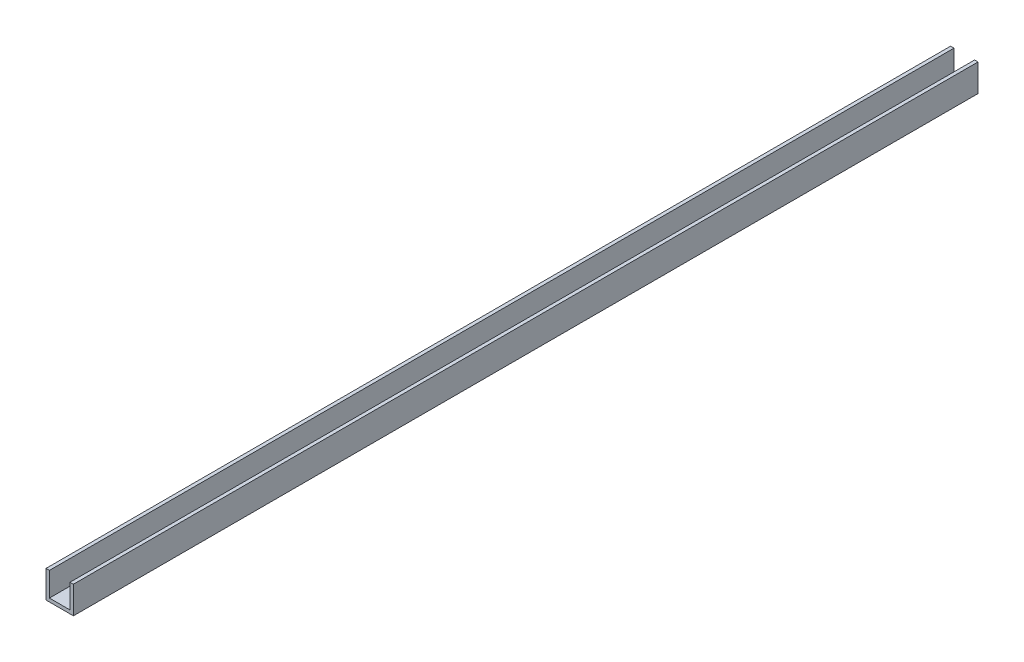
ISO-10303-21;
HEADER;
FILE_DESCRIPTION(('STEP AP214'),'2;1');
FILE_NAME('part.step','',(''),(''),'','','');
FILE_SCHEMA(('AUTOMOTIVE_DESIGN { 1 0 10303 214 1 1 1 1 }'));
ENDSEC;
DATA;
#1=APPLICATION_CONTEXT('core data for automotive mechanical design processes');
#2=APPLICATION_PROTOCOL_DEFINITION('international standard','automotive_design',2000,#1);
#3=PRODUCT_CONTEXT('',#1,'mechanical');
#4=PRODUCT('Part','Part','',(#3));
#5=PRODUCT_RELATED_PRODUCT_CATEGORY('part','',(#4));
#6=PRODUCT_DEFINITION_FORMATION('','',#4);
#7=PRODUCT_DEFINITION_CONTEXT('part definition',#1,'design');
#8=PRODUCT_DEFINITION('design','',#6,#7);
#9=PRODUCT_DEFINITION_SHAPE('','',#8);
#10=(LENGTH_UNIT() NAMED_UNIT(*) SI_UNIT(.MILLI.,.METRE.));
#11=(NAMED_UNIT(*) PLANE_ANGLE_UNIT() SI_UNIT($,.RADIAN.));
#12=(NAMED_UNIT(*) SI_UNIT($,.STERADIAN.) SOLID_ANGLE_UNIT());
#13=UNCERTAINTY_MEASURE_WITH_UNIT(LENGTH_MEASURE(1.E-05),#10,'distance_accuracy_value','');
#14=(GEOMETRIC_REPRESENTATION_CONTEXT(3) GLOBAL_UNCERTAINTY_ASSIGNED_CONTEXT((#13)) GLOBAL_UNIT_ASSIGNED_CONTEXT((#10,
#11,#12)) REPRESENTATION_CONTEXT('',''));
#15=CARTESIAN_POINT('',(0.,0.,0.));
#16=DIRECTION('',(0.,0.,1.));
#17=DIRECTION('',(1.,0.,0.));
#18=AXIS2_PLACEMENT_3D('',#15,#16,#17);
#19=CARTESIAN_POINT('',(25.4,0.,838.2));
#20=DIRECTION('',(-1.,0.,0.));
#21=DIRECTION('',(0.,0.,1.));
#22=AXIS2_PLACEMENT_3D('',#19,#20,#21);
#23=PLANE('',#22);
#24=DIRECTION('',(0.,1.,0.));
#25=VECTOR('',#24,1.);
#26=CARTESIAN_POINT('',(25.4,0.,0.));
#27=LINE('',#26,#25);
#28=CARTESIAN_POINT('',(25.4,0.,0.));
#29=VERTEX_POINT('',#28);
#30=CARTESIAN_POINT('',(25.4,25.4,0.));
#31=VERTEX_POINT('',#30);
#32=EDGE_CURVE('E130',#29,#31,#27,.T.);
#33=ORIENTED_EDGE('',*,*,#32,.T.);
#34=DIRECTION('',(0.,0.,-1.));
#35=VECTOR('',#34,1.);
#36=CARTESIAN_POINT('',(25.4,25.4,838.2));
#37=LINE('',#36,#35);
#38=CARTESIAN_POINT('',(25.4,25.4,838.2));
#39=VERTEX_POINT('',#38);
#40=EDGE_CURVE('E11',#39,#31,#37,.T.);
#41=ORIENTED_EDGE('',*,*,#40,.F.);
#42=DIRECTION('',(0.,1.,0.));
#43=VECTOR('',#42,1.);
#44=CARTESIAN_POINT('',(25.4,0.,838.2));
#45=LINE('',#44,#43);
#46=CARTESIAN_POINT('',(25.4,0.,838.2));
#47=VERTEX_POINT('',#46);
#48=EDGE_CURVE('E88',#47,#39,#45,.T.);
#49=ORIENTED_EDGE('',*,*,#48,.F.);
#50=DIRECTION('',(0.,0.,-1.));
#51=VECTOR('',#50,1.);
#52=CARTESIAN_POINT('',(25.4,0.,838.2));
#53=LINE('',#52,#51);
#54=EDGE_CURVE('E129',#47,#29,#53,.T.);
#55=ORIENTED_EDGE('',*,*,#54,.T.);
#56=EDGE_LOOP('',(#33,#41,#49,#55));
#57=FACE_BOUND('',#56,.T.);
#58=ADVANCED_FACE('F33',(#57),#23,.F.);
#59=CARTESIAN_POINT('',(22.225,25.4,838.2));
#60=DIRECTION('',(0.,1.,0.));
#61=DIRECTION('',(0.,0.,1.));
#62=AXIS2_PLACEMENT_3D('',#59,#60,#61);
#63=PLANE('',#62);
#64=DIRECTION('',(1.,0.,0.));
#65=VECTOR('',#64,1.);
#66=CARTESIAN_POINT('',(22.225,25.4,0.));
#67=LINE('',#66,#65);
#68=CARTESIAN_POINT('',(22.225,25.4,0.));
#69=VERTEX_POINT('',#68);
#70=EDGE_CURVE('E133',#69,#31,#67,.T.);
#71=ORIENTED_EDGE('',*,*,#70,.F.);
#72=DIRECTION('',(0.,0.,-1.));
#73=VECTOR('',#72,1.);
#74=CARTESIAN_POINT('',(22.225,25.4,838.2));
#75=LINE('',#74,#73);
#76=CARTESIAN_POINT('',(22.225,25.4,838.2));
#77=VERTEX_POINT('',#76);
#78=EDGE_CURVE('E41',#77,#69,#75,.T.);
#79=ORIENTED_EDGE('',*,*,#78,.F.);
#80=DIRECTION('',(1.,0.,0.));
#81=VECTOR('',#80,1.);
#82=CARTESIAN_POINT('',(22.225,25.4,838.2));
#83=LINE('',#82,#81);
#84=EDGE_CURVE('E172',#77,#39,#83,.T.);
#85=ORIENTED_EDGE('',*,*,#84,.T.);
#86=ORIENTED_EDGE('',*,*,#40,.T.);
#87=EDGE_LOOP('',(#71,#79,#85,#86));
#88=FACE_BOUND('',#87,.T.);
#89=ADVANCED_FACE('F163',(#88),#63,.T.);
#90=CARTESIAN_POINT('',(22.225,0.,838.2));
#91=DIRECTION('',(-1.,0.,0.));
#92=DIRECTION('',(0.,0.,1.));
#93=AXIS2_PLACEMENT_3D('',#90,#91,#92);
#94=PLANE('',#93);
#95=DIRECTION('',(0.,1.,0.));
#96=VECTOR('',#95,1.);
#97=CARTESIAN_POINT('',(22.225,0.,0.));
#98=LINE('',#97,#96);
#99=CARTESIAN_POINT('',(22.225,3.175,0.));
#100=VERTEX_POINT('',#99);
#101=EDGE_CURVE('E136',#100,#69,#98,.T.);
#102=ORIENTED_EDGE('',*,*,#101,.F.);
#103=DIRECTION('',(0.,0.,-1.));
#104=VECTOR('',#103,1.);
#105=CARTESIAN_POINT('',(22.225,3.175,838.2));
#106=LINE('',#105,#104);
#107=CARTESIAN_POINT('',(22.225,3.175,838.2));
#108=VERTEX_POINT('',#107);
#109=EDGE_CURVE('E153',#108,#100,#106,.T.);
#110=ORIENTED_EDGE('',*,*,#109,.F.);
#111=DIRECTION('',(0.,1.,0.));
#112=VECTOR('',#111,1.);
#113=CARTESIAN_POINT('',(22.225,0.,838.2));
#114=LINE('',#113,#112);
#115=EDGE_CURVE('E160',#108,#77,#114,.T.);
#116=ORIENTED_EDGE('',*,*,#115,.T.);
#117=ORIENTED_EDGE('',*,*,#78,.T.);
#118=EDGE_LOOP('',(#102,#110,#116,#117));
#119=FACE_BOUND('',#118,.T.);
#120=ADVANCED_FACE('F158',(#119),#94,.T.);
#121=CARTESIAN_POINT('',(0.,3.175,838.2));
#122=DIRECTION('',(0.,1.,0.));
#123=DIRECTION('',(0.,0.,1.));
#124=AXIS2_PLACEMENT_3D('',#121,#122,#123);
#125=PLANE('',#124);
#126=DIRECTION('',(1.,0.,0.));
#127=VECTOR('',#126,1.);
#128=CARTESIAN_POINT('',(0.,3.175,0.));
#129=LINE('',#128,#127);
#130=CARTESIAN_POINT('',(3.175,3.175,0.));
#131=VERTEX_POINT('',#130);
#132=EDGE_CURVE('E139',#131,#100,#129,.T.);
#133=ORIENTED_EDGE('',*,*,#132,.F.);
#134=DIRECTION('',(0.,0.,-1.));
#135=VECTOR('',#134,1.);
#136=CARTESIAN_POINT('',(3.175,3.175,838.2));
#137=LINE('',#136,#135);
#138=CARTESIAN_POINT('',(3.175,3.175,838.2));
#139=VERTEX_POINT('',#138);
#140=EDGE_CURVE('E151',#139,#131,#137,.T.);
#141=ORIENTED_EDGE('',*,*,#140,.F.);
#142=DIRECTION('',(1.,0.,0.));
#143=VECTOR('',#142,1.);
#144=CARTESIAN_POINT('',(0.,3.175,838.2));
#145=LINE('',#144,#143);
#146=EDGE_CURVE('E124',#139,#108,#145,.T.);
#147=ORIENTED_EDGE('',*,*,#146,.T.);
#148=ORIENTED_EDGE('',*,*,#109,.T.);
#149=EDGE_LOOP('',(#133,#141,#147,#148));
#150=FACE_BOUND('',#149,.T.);
#151=ADVANCED_FACE('F170',(#150),#125,.T.);
#152=CARTESIAN_POINT('',(3.175,0.,838.2));
#153=DIRECTION('',(1.,0.,0.));
#154=DIRECTION('',(0.,0.,-1.));
#155=AXIS2_PLACEMENT_3D('',#152,#153,#154);
#156=PLANE('',#155);
#157=DIRECTION('',(0.,1.,0.));
#158=VECTOR('',#157,1.);
#159=CARTESIAN_POINT('',(3.175,0.,0.));
#160=LINE('',#159,#158);
#161=CARTESIAN_POINT('',(3.175,25.4,0.));
#162=VERTEX_POINT('',#161);
#163=EDGE_CURVE('E142',#162,#131,#160,.F.);
#164=ORIENTED_EDGE('',*,*,#163,.F.);
#165=DIRECTION('',(0.,0.,-1.));
#166=VECTOR('',#165,1.);
#167=CARTESIAN_POINT('',(3.175,25.4,838.2));
#168=LINE('',#167,#166);
#169=CARTESIAN_POINT('',(3.175,25.4,838.2));
#170=VERTEX_POINT('',#169);
#171=EDGE_CURVE('E112',#170,#162,#168,.T.);
#172=ORIENTED_EDGE('',*,*,#171,.F.);
#173=DIRECTION('',(0.,1.,0.));
#174=VECTOR('',#173,1.);
#175=CARTESIAN_POINT('',(3.175,0.,838.2));
#176=LINE('',#175,#174);
#177=EDGE_CURVE('E122',#170,#139,#176,.F.);
#178=ORIENTED_EDGE('',*,*,#177,.T.);
#179=ORIENTED_EDGE('',*,*,#140,.T.);
#180=EDGE_LOOP('',(#164,#172,#178,#179));
#181=FACE_BOUND('',#180,.T.);
#182=ADVANCED_FACE('F177',(#181),#156,.T.);
#183=CARTESIAN_POINT('',(0.,25.4,838.2));
#184=DIRECTION('',(0.,1.,0.));
#185=DIRECTION('',(0.,0.,1.));
#186=AXIS2_PLACEMENT_3D('',#183,#184,#185);
#187=PLANE('',#186);
#188=DIRECTION('',(1.,0.,0.));
#189=VECTOR('',#188,1.);
#190=CARTESIAN_POINT('',(0.,25.4,0.));
#191=LINE('',#190,#189);
#192=CARTESIAN_POINT('',(0.,25.4,0.));
#193=VERTEX_POINT('',#192);
#194=EDGE_CURVE('E111',#193,#162,#191,.T.);
#195=ORIENTED_EDGE('',*,*,#194,.F.);
#196=DIRECTION('',(0.,0.,-1.));
#197=VECTOR('',#196,1.);
#198=CARTESIAN_POINT('',(0.,25.4,838.2));
#199=LINE('',#198,#197);
#200=CARTESIAN_POINT('',(0.,25.4,838.2));
#201=VERTEX_POINT('',#200);
#202=EDGE_CURVE('E105',#201,#193,#199,.T.);
#203=ORIENTED_EDGE('',*,*,#202,.F.);
#204=DIRECTION('',(1.,0.,0.));
#205=VECTOR('',#204,1.);
#206=CARTESIAN_POINT('',(0.,25.4,838.2));
#207=LINE('',#206,#205);
#208=EDGE_CURVE('E109',#201,#170,#207,.T.);
#209=ORIENTED_EDGE('',*,*,#208,.T.);
#210=ORIENTED_EDGE('',*,*,#171,.T.);
#211=EDGE_LOOP('',(#195,#203,#209,#210));
#212=FACE_BOUND('',#211,.T.);
#213=ADVANCED_FACE('F107',(#212),#187,.T.);
#214=CARTESIAN_POINT('',(0.,0.,838.2));
#215=DIRECTION('',(1.,0.,0.));
#216=DIRECTION('',(0.,0.,-1.));
#217=AXIS2_PLACEMENT_3D('',#214,#215,#216);
#218=PLANE('',#217);
#219=DIRECTION('',(0.,-1.,0.));
#220=VECTOR('',#219,1.);
#221=CARTESIAN_POINT('',(0.,0.,0.));
#222=LINE('',#221,#220);
#223=CARTESIAN_POINT('',(0.,0.,0.));
#224=VERTEX_POINT('',#223);
#225=EDGE_CURVE('E76',#193,#224,#222,.T.);
#226=ORIENTED_EDGE('',*,*,#225,.T.);
#227=DIRECTION('',(0.,0.,-1.));
#228=VECTOR('',#227,1.);
#229=CARTESIAN_POINT('',(0.,0.,838.2));
#230=LINE('',#229,#228);
#231=CARTESIAN_POINT('',(0.,0.,838.2));
#232=VERTEX_POINT('',#231);
#233=EDGE_CURVE('E113',#232,#224,#230,.T.);
#234=ORIENTED_EDGE('',*,*,#233,.F.);
#235=DIRECTION('',(0.,-1.,0.));
#236=VECTOR('',#235,1.);
#237=CARTESIAN_POINT('',(0.,0.,838.2));
#238=LINE('',#237,#236);
#239=EDGE_CURVE('E115',#201,#232,#238,.T.);
#240=ORIENTED_EDGE('',*,*,#239,.F.);
#241=ORIENTED_EDGE('',*,*,#202,.T.);
#242=EDGE_LOOP('',(#226,#234,#240,#241));
#243=FACE_BOUND('',#242,.T.);
#244=ADVANCED_FACE('F116',(#243),#218,.F.);
#245=CARTESIAN_POINT('',(0.,0.,838.2));
#246=DIRECTION('',(0.,1.,0.));
#247=DIRECTION('',(0.,0.,1.));
#248=AXIS2_PLACEMENT_3D('',#245,#246,#247);
#249=PLANE('',#248);
#250=DIRECTION('',(1.,0.,0.));
#251=VECTOR('',#250,1.);
#252=CARTESIAN_POINT('',(0.,0.,0.));
#253=LINE('',#252,#251);
#254=EDGE_CURVE('E82',#224,#29,#253,.T.);
#255=ORIENTED_EDGE('',*,*,#254,.T.);
#256=ORIENTED_EDGE('',*,*,#54,.F.);
#257=DIRECTION('',(1.,0.,0.));
#258=VECTOR('',#257,1.);
#259=CARTESIAN_POINT('',(0.,0.,838.2));
#260=LINE('',#259,#258);
#261=EDGE_CURVE('E49',#232,#47,#260,.T.);
#262=ORIENTED_EDGE('',*,*,#261,.F.);
#263=ORIENTED_EDGE('',*,*,#233,.T.);
#264=EDGE_LOOP('',(#255,#256,#262,#263));
#265=FACE_BOUND('',#264,.T.);
#266=ADVANCED_FACE('F179',(#265),#249,.F.);
#267=CARTESIAN_POINT('',(0.,0.,838.2));
#268=DIRECTION('',(0.,0.,-1.));
#269=DIRECTION('',(-1.,0.,0.));
#270=AXIS2_PLACEMENT_3D('',#267,#268,#269);
#271=PLANE('',#270);
#272=ORIENTED_EDGE('',*,*,#48,.T.);
#273=ORIENTED_EDGE('',*,*,#84,.F.);
#274=ORIENTED_EDGE('',*,*,#115,.F.);
#275=ORIENTED_EDGE('',*,*,#146,.F.);
#276=ORIENTED_EDGE('',*,*,#177,.F.);
#277=ORIENTED_EDGE('',*,*,#208,.F.);
#278=ORIENTED_EDGE('',*,*,#239,.T.);
#279=ORIENTED_EDGE('',*,*,#261,.T.);
#280=EDGE_LOOP('',(#272,#273,#274,#275,#276,#277,#278,#279));
#281=FACE_BOUND('',#280,.T.);
#282=ADVANCED_FACE('F119',(#281),#271,.F.);
#283=CARTESIAN_POINT('',(0.,0.,0.));
#284=DIRECTION('',(0.,0.,-1.));
#285=DIRECTION('',(-1.,0.,0.));
#286=AXIS2_PLACEMENT_3D('',#283,#284,#285);
#287=PLANE('',#286);
#288=ORIENTED_EDGE('',*,*,#32,.F.);
#289=ORIENTED_EDGE('',*,*,#254,.F.);
#290=ORIENTED_EDGE('',*,*,#225,.F.);
#291=ORIENTED_EDGE('',*,*,#194,.T.);
#292=ORIENTED_EDGE('',*,*,#163,.T.);
#293=ORIENTED_EDGE('',*,*,#132,.T.);
#294=ORIENTED_EDGE('',*,*,#101,.T.);
#295=ORIENTED_EDGE('',*,*,#70,.T.);
#296=EDGE_LOOP('',(#288,#289,#290,#291,#292,#293,#294,#295));
#297=FACE_BOUND('',#296,.T.);
#298=ADVANCED_FACE('F166',(#297),#287,.T.);
#299=CLOSED_SHELL('',(#58,#89,#120,#151,#182,#213,#244,#266,#282,#298));
#300=MANIFOLD_SOLID_BREP('B2',#299);
#301=ADVANCED_BREP_SHAPE_REPRESENTATION('',(#18,#300),#14);
#302=SHAPE_DEFINITION_REPRESENTATION(#9,#301);
ENDSEC;
END-ISO-10303-21;
